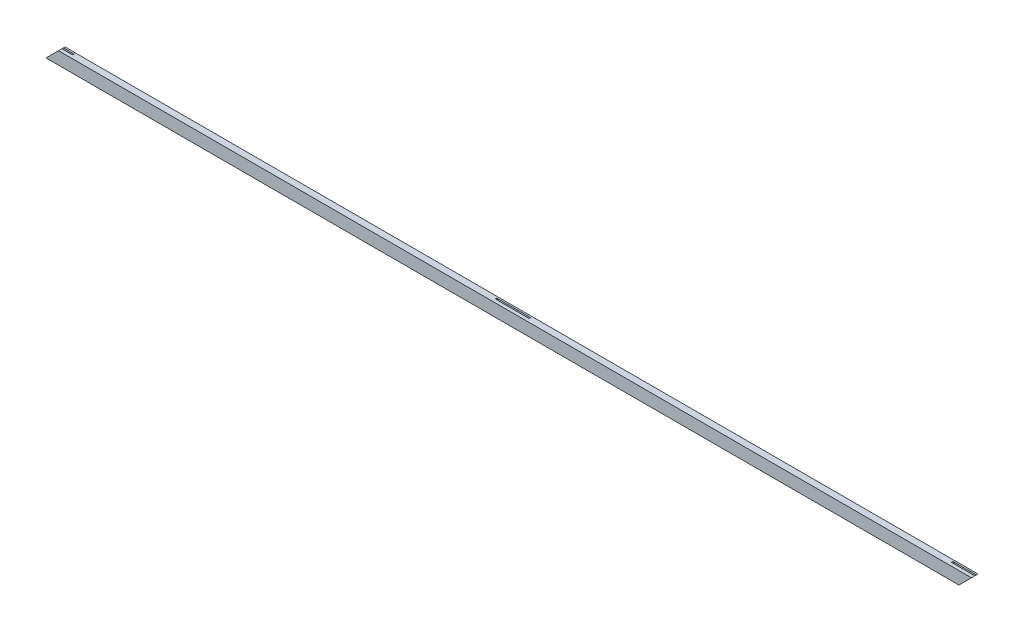
ISO-10303-21;
HEADER;
FILE_DESCRIPTION(('STEP AP214'),'2;1');
FILE_NAME('part.step','',(''),(''),'','','');
FILE_SCHEMA(('AUTOMOTIVE_DESIGN { 1 0 10303 214 1 1 1 1 }'));
ENDSEC;
DATA;
#1=APPLICATION_CONTEXT('core data for automotive mechanical design processes');
#2=APPLICATION_PROTOCOL_DEFINITION('international standard','automotive_design',2000,#1);
#3=PRODUCT_CONTEXT('',#1,'mechanical');
#4=PRODUCT('Part','Part','',(#3));
#5=PRODUCT_RELATED_PRODUCT_CATEGORY('part','',(#4));
#6=PRODUCT_DEFINITION_FORMATION('','',#4);
#7=PRODUCT_DEFINITION_CONTEXT('part definition',#1,'design');
#8=PRODUCT_DEFINITION('design','',#6,#7);
#9=PRODUCT_DEFINITION_SHAPE('','',#8);
#10=(LENGTH_UNIT() NAMED_UNIT(*) SI_UNIT(.MILLI.,.METRE.));
#11=(NAMED_UNIT(*) PLANE_ANGLE_UNIT() SI_UNIT($,.RADIAN.));
#12=(NAMED_UNIT(*) SI_UNIT($,.STERADIAN.) SOLID_ANGLE_UNIT());
#13=UNCERTAINTY_MEASURE_WITH_UNIT(LENGTH_MEASURE(1.E-05),#10,'distance_accuracy_value','');
#14=(GEOMETRIC_REPRESENTATION_CONTEXT(3) GLOBAL_UNCERTAINTY_ASSIGNED_CONTEXT((#13)) GLOBAL_UNIT_ASSIGNED_CONTEXT((#10,
#11,#12)) REPRESENTATION_CONTEXT('',''));
#15=CARTESIAN_POINT('',(0.,0.,0.));
#16=DIRECTION('',(0.,0.,1.));
#17=DIRECTION('',(1.,0.,0.));
#18=AXIS2_PLACEMENT_3D('',#15,#16,#17);
#19=CARTESIAN_POINT('',(3546.,48.0000000000002,25.));
#20=DIRECTION('',(0.,-1.,0.));
#21=DIRECTION('',(1.,0.,0.));
#22=AXIS2_PLACEMENT_3D('',#19,#20,#21);
#23=PLANE('',#22);
#24=DIRECTION('',(0.,0.,-1.));
#25=VECTOR('',#24,1.);
#26=CARTESIAN_POINT('',(1838.,48.,6.00000000000001));
#27=LINE('',#26,#25);
#28=CARTESIAN_POINT('',(1838.,48.,6.00000000000001));
#29=VERTEX_POINT('',#28);
#30=CARTESIAN_POINT('',(1838.,48.,12.));
#31=VERTEX_POINT('',#30);
#32=EDGE_CURVE('E395',#29,#31,#27,.F.);
#33=ORIENTED_EDGE('',*,*,#32,.T.);
#34=DIRECTION('',(-1.,0.,0.));
#35=VECTOR('',#34,1.);
#36=CARTESIAN_POINT('',(1830.5,48.,12.));
#37=LINE('',#36,#35);
#38=CARTESIAN_POINT('',(1708.,48.,12.));
#39=VERTEX_POINT('',#38);
#40=EDGE_CURVE('E11',#31,#39,#37,.T.);
#41=ORIENTED_EDGE('',*,*,#40,.T.);
#42=DIRECTION('',(0.,0.,1.));
#43=VECTOR('',#42,1.);
#44=CARTESIAN_POINT('',(1708.,48.,12.));
#45=LINE('',#44,#43);
#46=CARTESIAN_POINT('',(1708.,48.,6.));
#47=VERTEX_POINT('',#46);
#48=EDGE_CURVE('E431',#39,#47,#45,.F.);
#49=ORIENTED_EDGE('',*,*,#48,.T.);
#50=DIRECTION('',(1.,0.,0.));
#51=VECTOR('',#50,1.);
#52=CARTESIAN_POINT('',(1715.5,48.,6.));
#53=LINE('',#52,#51);
#54=EDGE_CURVE('E426',#47,#29,#53,.T.);
#55=ORIENTED_EDGE('',*,*,#54,.T.);
#56=EDGE_LOOP('',(#33,#41,#49,#55));
#57=FACE_BOUND('',#56,.T.);
#58=DIRECTION('',(-1.,0.,0.));
#59=VECTOR('',#58,1.);
#60=CARTESIAN_POINT('',(89.5000000000006,48.0000000000002,6.));
#61=LINE('',#60,#59);
#62=CARTESIAN_POINT('',(89.5000000000006,48.0000000000002,6.));
#63=VERTEX_POINT('',#62);
#64=CARTESIAN_POINT('',(48.0000000000001,47.9999999999996,6.));
#65=VERTEX_POINT('',#64);
#66=EDGE_CURVE('E287',#63,#65,#61,.T.);
#67=ORIENTED_EDGE('',*,*,#66,.F.);
#68=DIRECTION('',(0.,0.,1.));
#69=VECTOR('',#68,1.);
#70=CARTESIAN_POINT('',(89.5000000000006,48.0000000000002,6.));
#71=LINE('',#70,#69);
#72=CARTESIAN_POINT('',(89.5000000000006,48.0000000000002,12.));
#73=VERTEX_POINT('',#72);
#74=EDGE_CURVE('E294',#63,#73,#71,.T.);
#75=ORIENTED_EDGE('',*,*,#74,.T.);
#76=DIRECTION('',(-1.,0.,0.));
#77=VECTOR('',#76,1.);
#78=CARTESIAN_POINT('',(89.5000000000006,48.0000000000002,12.));
#79=LINE('',#78,#77);
#80=CARTESIAN_POINT('',(48.0000000000001,47.9999999999996,12.));
#81=VERTEX_POINT('',#80);
#82=EDGE_CURVE('E298',#73,#81,#79,.T.);
#83=ORIENTED_EDGE('',*,*,#82,.T.);
#84=DIRECTION('',(0.,0.,-1.));
#85=VECTOR('',#84,1.);
#86=CARTESIAN_POINT('',(48.0000000000001,47.9999999999996,25.));
#87=LINE('',#86,#85);
#88=CARTESIAN_POINT('',(48.0000000000001,47.9999999999996,25.));
#89=VERTEX_POINT('',#88);
#90=EDGE_CURVE('E392',#89,#81,#87,.T.);
#91=ORIENTED_EDGE('',*,*,#90,.F.);
#92=DIRECTION('',(-1.,0.,0.));
#93=VECTOR('',#92,1.);
#94=CARTESIAN_POINT('',(3546.,48.0000000000002,25.));
#95=LINE('',#94,#93);
#96=CARTESIAN_POINT('',(3546.,48.0000000000002,25.));
#97=VERTEX_POINT('',#96);
#98=EDGE_CURVE('E358',#97,#89,#95,.T.);
#99=ORIENTED_EDGE('',*,*,#98,.F.);
#100=DIRECTION('',(0.,0.,-1.));
#101=VECTOR('',#100,1.);
#102=CARTESIAN_POINT('',(3546.,48.0000000000002,25.));
#103=LINE('',#102,#101);
#104=CARTESIAN_POINT('',(3546.,48.0000000000002,12.));
#105=VERTEX_POINT('',#104);
#106=EDGE_CURVE('E381',#97,#105,#103,.T.);
#107=ORIENTED_EDGE('',*,*,#106,.T.);
#108=DIRECTION('',(-1.,0.,0.));
#109=VECTOR('',#108,1.);
#110=CARTESIAN_POINT('',(3546.,48.0000000000002,12.));
#111=LINE('',#110,#109);
#112=CARTESIAN_POINT('',(3456.5,48.0000000000002,12.));
#113=VERTEX_POINT('',#112);
#114=EDGE_CURVE('E279',#105,#113,#111,.T.);
#115=ORIENTED_EDGE('',*,*,#114,.T.);
#116=DIRECTION('',(0.,0.,1.));
#117=VECTOR('',#116,1.);
#118=CARTESIAN_POINT('',(3456.5,48.0000000000002,6.));
#119=LINE('',#118,#117);
#120=CARTESIAN_POINT('',(3456.5,48.0000000000002,6.));
#121=VERTEX_POINT('',#120);
#122=EDGE_CURVE('E322',#121,#113,#119,.T.);
#123=ORIENTED_EDGE('',*,*,#122,.F.);
#124=DIRECTION('',(-1.,0.,0.));
#125=VECTOR('',#124,1.);
#126=CARTESIAN_POINT('',(3546.,48.0000000000002,6.));
#127=LINE('',#126,#125);
#128=CARTESIAN_POINT('',(3546.,48.0000000000002,6.));
#129=VERTEX_POINT('',#128);
#130=EDGE_CURVE('E310',#129,#121,#127,.T.);
#131=ORIENTED_EDGE('',*,*,#130,.F.);
#132=CARTESIAN_POINT('',(3546.,48.0000000000002,0.));
#133=VERTEX_POINT('',#132);
#134=EDGE_CURVE('E368',#129,#133,#103,.T.);
#135=ORIENTED_EDGE('',*,*,#134,.T.);
#136=DIRECTION('',(-1.,0.,0.));
#137=VECTOR('',#136,1.);
#138=CARTESIAN_POINT('',(3546.,48.0000000000002,0.));
#139=LINE('',#138,#137);
#140=CARTESIAN_POINT('',(48.0000000000001,47.9999999999996,0.));
#141=VERTEX_POINT('',#140);
#142=EDGE_CURVE('E369',#133,#141,#139,.T.);
#143=ORIENTED_EDGE('',*,*,#142,.T.);
#144=EDGE_CURVE('E391',#65,#141,#87,.T.);
#145=ORIENTED_EDGE('',*,*,#144,.F.);
#146=EDGE_LOOP('',(#67,#75,#83,#91,#99,#107,#115,#123,#131,#135,#143,#145));
#147=FACE_BOUND('',#146,.T.);
#148=ADVANCED_FACE('F35',(#57,#147),#23,.F.);
#149=CARTESIAN_POINT('',(48.0000000000001,47.9999999999996,25.));
#150=DIRECTION('',(0.707106781186544,-0.707106781186551,0.));
#151=DIRECTION('',(0.707106781186551,0.707106781186544,0.));
#152=AXIS2_PLACEMENT_3D('',#149,#150,#151);
#153=PLANE('',#152);
#154=DIRECTION('',(-0.707106781186547,-0.707106781186547,0.));
#155=VECTOR('',#154,1.);
#156=CARTESIAN_POINT('',(48.0000000000001,47.9999999999996,6.));
#157=LINE('',#156,#155);
#158=CARTESIAN_POINT('',(40.5000000000007,40.5000000000002,6.));
#159=VERTEX_POINT('',#158);
#160=EDGE_CURVE('E289',#65,#159,#157,.T.);
#161=ORIENTED_EDGE('',*,*,#160,.F.);
#162=ORIENTED_EDGE('',*,*,#144,.T.);
#163=DIRECTION('',(-0.707106781186551,-0.707106781186544,0.));
#164=VECTOR('',#163,1.);
#165=CARTESIAN_POINT('',(48.0000000000001,47.9999999999996,0.));
#166=LINE('',#165,#164);
#167=CARTESIAN_POINT('',(0.,0.,0.));
#168=VERTEX_POINT('',#167);
#169=EDGE_CURVE('E372',#141,#168,#166,.T.);
#170=ORIENTED_EDGE('',*,*,#169,.T.);
#171=DIRECTION('',(0.,0.,-1.));
#172=VECTOR('',#171,1.);
#173=CARTESIAN_POINT('',(0.,0.,25.));
#174=LINE('',#173,#172);
#175=CARTESIAN_POINT('',(0.,0.,6.));
#176=VERTEX_POINT('',#175);
#177=EDGE_CURVE('E388',#176,#168,#174,.T.);
#178=ORIENTED_EDGE('',*,*,#177,.F.);
#179=DIRECTION('',(-0.707106781186571,-0.707106781186525,0.));
#180=VECTOR('',#179,1.);
#181=CARTESIAN_POINT('',(0.,0.,6.));
#182=LINE('',#181,#180);
#183=CARTESIAN_POINT('',(7.50000000000048,7.49999999999999,6.));
#184=VERTEX_POINT('',#183);
#185=EDGE_CURVE('E236',#184,#176,#182,.T.);
#186=ORIENTED_EDGE('',*,*,#185,.F.);
#187=DIRECTION('',(0.,0.,1.));
#188=VECTOR('',#187,1.);
#189=CARTESIAN_POINT('',(7.50000000000048,7.49999999999999,6.));
#190=LINE('',#189,#188);
#191=CARTESIAN_POINT('',(7.50000000000048,7.49999999999999,12.));
#192=VERTEX_POINT('',#191);
#193=EDGE_CURVE('E246',#184,#192,#190,.T.);
#194=ORIENTED_EDGE('',*,*,#193,.T.);
#195=DIRECTION('',(-0.707106781186571,-0.707106781186525,0.));
#196=VECTOR('',#195,1.);
#197=CARTESIAN_POINT('',(0.,0.,12.));
#198=LINE('',#197,#196);
#199=CARTESIAN_POINT('',(0.,0.,12.));
#200=VERTEX_POINT('',#199);
#201=EDGE_CURVE('E239',#192,#200,#198,.T.);
#202=ORIENTED_EDGE('',*,*,#201,.T.);
#203=CARTESIAN_POINT('',(0.,0.,25.));
#204=VERTEX_POINT('',#203);
#205=EDGE_CURVE('E389',#204,#200,#174,.T.);
#206=ORIENTED_EDGE('',*,*,#205,.F.);
#207=DIRECTION('',(-0.707106781186551,-0.707106781186544,0.));
#208=VECTOR('',#207,1.);
#209=CARTESIAN_POINT('',(48.0000000000001,47.9999999999996,25.));
#210=LINE('',#209,#208);
#211=EDGE_CURVE('E361',#89,#204,#210,.T.);
#212=ORIENTED_EDGE('',*,*,#211,.F.);
#213=ORIENTED_EDGE('',*,*,#90,.T.);
#214=DIRECTION('',(-0.707106781186547,-0.707106781186547,0.));
#215=VECTOR('',#214,1.);
#216=CARTESIAN_POINT('',(48.0000000000001,47.9999999999996,12.));
#217=LINE('',#216,#215);
#218=CARTESIAN_POINT('',(40.5000000000007,40.5000000000003,12.));
#219=VERTEX_POINT('',#218);
#220=EDGE_CURVE('E301',#81,#219,#217,.T.);
#221=ORIENTED_EDGE('',*,*,#220,.T.);
#222=DIRECTION('',(0.,0.,1.));
#223=VECTOR('',#222,1.);
#224=CARTESIAN_POINT('',(40.5000000000007,40.5000000000002,6.));
#225=LINE('',#224,#223);
#226=EDGE_CURVE('E306',#159,#219,#225,.T.);
#227=ORIENTED_EDGE('',*,*,#226,.F.);
#228=EDGE_LOOP('',(#161,#162,#170,#178,#186,#194,#202,#206,#212,#213,#221,#227));
#229=FACE_BOUND('',#228,.T.);
#230=ADVANCED_FACE('F460',(#229),#153,.F.);
#231=CARTESIAN_POINT('',(3498.,0.,25.));
#232=DIRECTION('',(-0.707106781186549,0.707106781186546,0.));
#233=DIRECTION('',(-0.707106781186546,-0.707106781186549,0.));
#234=AXIS2_PLACEMENT_3D('',#231,#232,#233);
#235=PLANE('',#234);
#236=DIRECTION('',(0.,0.,1.));
#237=VECTOR('',#236,1.);
#238=CARTESIAN_POINT('',(3505.5,7.5,6.));
#239=LINE('',#238,#237);
#240=CARTESIAN_POINT('',(3505.5,7.5,6.));
#241=VERTEX_POINT('',#240);
#242=CARTESIAN_POINT('',(3505.5,7.5,12.));
#243=VERTEX_POINT('',#242);
#244=EDGE_CURVE('E263',#241,#243,#239,.T.);
#245=ORIENTED_EDGE('',*,*,#244,.F.);
#246=DIRECTION('',(0.70710678118654,0.707106781186555,0.));
#247=VECTOR('',#246,1.);
#248=CARTESIAN_POINT('',(3505.5,7.5,6.));
#249=LINE('',#248,#247);
#250=CARTESIAN_POINT('',(3498.,0.,6.));
#251=VERTEX_POINT('',#250);
#252=EDGE_CURVE('E253',#251,#241,#249,.T.);
#253=ORIENTED_EDGE('',*,*,#252,.F.);
#254=DIRECTION('',(0.,0.,-1.));
#255=VECTOR('',#254,1.);
#256=CARTESIAN_POINT('',(3498.,0.,25.));
#257=LINE('',#256,#255);
#258=CARTESIAN_POINT('',(3498.,0.,0.));
#259=VERTEX_POINT('',#258);
#260=EDGE_CURVE('E384',#251,#259,#257,.T.);
#261=ORIENTED_EDGE('',*,*,#260,.T.);
#262=DIRECTION('',(0.707106781186546,0.707106781186549,0.));
#263=VECTOR('',#262,1.);
#264=CARTESIAN_POINT('',(3498.,0.,0.));
#265=LINE('',#264,#263);
#266=EDGE_CURVE('E362',#259,#133,#265,.T.);
#267=ORIENTED_EDGE('',*,*,#266,.T.);
#268=ORIENTED_EDGE('',*,*,#134,.F.);
#269=DIRECTION('',(0.70710678118654,0.707106781186555,0.));
#270=VECTOR('',#269,1.);
#271=CARTESIAN_POINT('',(3538.5,40.5000000000002,6.));
#272=LINE('',#271,#270);
#273=CARTESIAN_POINT('',(3538.5,40.5000000000002,6.));
#274=VERTEX_POINT('',#273);
#275=EDGE_CURVE('E320',#274,#129,#272,.T.);
#276=ORIENTED_EDGE('',*,*,#275,.F.);
#277=DIRECTION('',(0.,0.,1.));
#278=VECTOR('',#277,1.);
#279=CARTESIAN_POINT('',(3538.5,40.5000000000002,6.));
#280=LINE('',#279,#278);
#281=CARTESIAN_POINT('',(3538.5,40.5000000000002,12.));
#282=VERTEX_POINT('',#281);
#283=EDGE_CURVE('E332',#274,#282,#280,.T.);
#284=ORIENTED_EDGE('',*,*,#283,.T.);
#285=DIRECTION('',(0.70710678118654,0.707106781186555,0.));
#286=VECTOR('',#285,1.);
#287=CARTESIAN_POINT('',(3538.5,40.5000000000002,12.));
#288=LINE('',#287,#286);
#289=EDGE_CURVE('E314',#282,#105,#288,.T.);
#290=ORIENTED_EDGE('',*,*,#289,.T.);
#291=ORIENTED_EDGE('',*,*,#106,.F.);
#292=DIRECTION('',(0.707106781186546,0.707106781186549,0.));
#293=VECTOR('',#292,1.);
#294=CARTESIAN_POINT('',(3498.,0.,25.));
#295=LINE('',#294,#293);
#296=CARTESIAN_POINT('',(3498.,0.,25.));
#297=VERTEX_POINT('',#296);
#298=EDGE_CURVE('E366',#297,#97,#295,.T.);
#299=ORIENTED_EDGE('',*,*,#298,.F.);
#300=CARTESIAN_POINT('',(3498.,0.,12.));
#301=VERTEX_POINT('',#300);
#302=EDGE_CURVE('E385',#297,#301,#257,.T.);
#303=ORIENTED_EDGE('',*,*,#302,.T.);
#304=DIRECTION('',(0.70710678118654,0.707106781186555,0.));
#305=VECTOR('',#304,1.);
#306=CARTESIAN_POINT('',(3505.5,7.5,12.));
#307=LINE('',#306,#305);
#308=EDGE_CURVE('E267',#301,#243,#307,.T.);
#309=ORIENTED_EDGE('',*,*,#308,.T.);
#310=EDGE_LOOP('',(#245,#253,#261,#267,#268,#276,#284,#290,#291,#299,#303,#309));
#311=FACE_BOUND('',#310,.T.);
#312=ADVANCED_FACE('F465',(#311),#235,.F.);
#313=CARTESIAN_POINT('',(1830.5,40.5,12.));
#314=DIRECTION('',(0.,0.,1.));
#315=DIRECTION('',(1.,0.,0.));
#316=AXIS2_PLACEMENT_3D('',#313,#314,#315);
#317=PLANE('',#316);
#318=ORIENTED_EDGE('',*,*,#40,.F.);
#319=DIRECTION('',(-0.707106781186549,-0.707106781186546,0.));
#320=VECTOR('',#319,1.);
#321=CARTESIAN_POINT('',(1830.5,40.5,12.));
#322=LINE('',#321,#320);
#323=CARTESIAN_POINT('',(1830.5,40.5,12.));
#324=VERTEX_POINT('',#323);
#325=EDGE_CURVE('E409',#324,#31,#322,.F.);
#326=ORIENTED_EDGE('',*,*,#325,.F.);
#327=DIRECTION('',(-1.,0.,0.));
#328=VECTOR('',#327,1.);
#329=CARTESIAN_POINT('',(1830.5,40.5,12.));
#330=LINE('',#329,#328);
#331=CARTESIAN_POINT('',(1715.5,40.5,12.));
#332=VERTEX_POINT('',#331);
#333=EDGE_CURVE('E420',#324,#332,#330,.T.);
#334=ORIENTED_EDGE('',*,*,#333,.T.);
#335=DIRECTION('',(0.707106781186549,-0.707106781186546,0.));
#336=VECTOR('',#335,1.);
#337=CARTESIAN_POINT('',(1773.,-17.0000000000001,12.));
#338=LINE('',#337,#336);
#339=EDGE_CURVE('E43',#332,#39,#338,.F.);
#340=ORIENTED_EDGE('',*,*,#339,.T.);
#341=EDGE_LOOP('',(#318,#326,#334,#340));
#342=FACE_BOUND('',#341,.T.);
#343=ADVANCED_FACE('F37',(#342),#317,.F.);
#344=CARTESIAN_POINT('',(1715.5,40.5,12.));
#345=DIRECTION('',(0.707106781186546,0.707106781186549,0.));
#346=DIRECTION('',(0.707106781186549,-0.707106781186546,0.));
#347=AXIS2_PLACEMENT_3D('',#344,#345,#346);
#348=PLANE('',#347);
#349=ORIENTED_EDGE('',*,*,#48,.F.);
#350=ORIENTED_EDGE('',*,*,#339,.F.);
#351=DIRECTION('',(0.,0.,-1.));
#352=VECTOR('',#351,1.);
#353=CARTESIAN_POINT('',(1715.5,40.5,12.));
#354=LINE('',#353,#352);
#355=CARTESIAN_POINT('',(1715.5,40.5,6.));
#356=VERTEX_POINT('',#355);
#357=EDGE_CURVE('E423',#332,#356,#354,.T.);
#358=ORIENTED_EDGE('',*,*,#357,.T.);
#359=DIRECTION('',(0.707106781186549,-0.707106781186546,0.));
#360=VECTOR('',#359,1.);
#361=CARTESIAN_POINT('',(1715.5,40.5,6.));
#362=LINE('',#361,#360);
#363=EDGE_CURVE('E428',#356,#47,#362,.F.);
#364=ORIENTED_EDGE('',*,*,#363,.T.);
#365=EDGE_LOOP('',(#349,#350,#358,#364));
#366=FACE_BOUND('',#365,.T.);
#367=ADVANCED_FACE('F438',(#366),#348,.T.);
#368=CARTESIAN_POINT('',(1715.5,40.5,6.));
#369=DIRECTION('',(0.,0.,-1.));
#370=DIRECTION('',(-1.,0.,0.));
#371=AXIS2_PLACEMENT_3D('',#368,#369,#370);
#372=PLANE('',#371);
#373=ORIENTED_EDGE('',*,*,#54,.F.);
#374=ORIENTED_EDGE('',*,*,#363,.F.);
#375=DIRECTION('',(1.,0.,0.));
#376=VECTOR('',#375,1.);
#377=CARTESIAN_POINT('',(1715.5,40.5,6.));
#378=LINE('',#377,#376);
#379=CARTESIAN_POINT('',(1830.5,40.5,6.00000000000001));
#380=VERTEX_POINT('',#379);
#381=EDGE_CURVE('E418',#356,#380,#378,.T.);
#382=ORIENTED_EDGE('',*,*,#381,.T.);
#383=DIRECTION('',(-0.707106781186549,-0.707106781186546,0.));
#384=VECTOR('',#383,1.);
#385=CARTESIAN_POINT('',(1773.,-17.0000000000001,6.));
#386=LINE('',#385,#384);
#387=EDGE_CURVE('E415',#380,#29,#386,.F.);
#388=ORIENTED_EDGE('',*,*,#387,.T.);
#389=EDGE_LOOP('',(#373,#374,#382,#388));
#390=FACE_BOUND('',#389,.T.);
#391=ADVANCED_FACE('F451',(#390),#372,.F.);
#392=CARTESIAN_POINT('',(0.,40.5,0.));
#393=DIRECTION('',(0.,1.,0.));
#394=DIRECTION('',(0.,0.,-1.));
#395=AXIS2_PLACEMENT_3D('',#392,#393,#394);
#396=PLANE('',#395);
#397=ORIENTED_EDGE('',*,*,#381,.F.);
#398=ORIENTED_EDGE('',*,*,#357,.F.);
#399=ORIENTED_EDGE('',*,*,#333,.F.);
#400=DIRECTION('',(0.,0.,1.));
#401=VECTOR('',#400,1.);
#402=CARTESIAN_POINT('',(1830.5,40.5,6.00000000000001));
#403=LINE('',#402,#401);
#404=EDGE_CURVE('E412',#380,#324,#403,.T.);
#405=ORIENTED_EDGE('',*,*,#404,.F.);
#406=EDGE_LOOP('',(#397,#398,#399,#405));
#407=FACE_BOUND('',#406,.T.);
#408=ADVANCED_FACE('F449',(#407),#396,.T.);
#409=CARTESIAN_POINT('',(1830.5,40.5,6.00000000000001));
#410=DIRECTION('',(-0.707106781186546,0.707106781186549,0.));
#411=DIRECTION('',(0.707106781186549,0.707106781186546,0.));
#412=AXIS2_PLACEMENT_3D('',#409,#410,#411);
#413=PLANE('',#412);
#414=ORIENTED_EDGE('',*,*,#32,.F.);
#415=ORIENTED_EDGE('',*,*,#387,.F.);
#416=ORIENTED_EDGE('',*,*,#404,.T.);
#417=ORIENTED_EDGE('',*,*,#325,.T.);
#418=EDGE_LOOP('',(#414,#415,#416,#417));
#419=FACE_BOUND('',#418,.T.);
#420=ADVANCED_FACE('F445',(#419),#413,.T.);
#421=CARTESIAN_POINT('',(0.,0.,25.));
#422=DIRECTION('',(0.,1.,0.));
#423=DIRECTION('',(0.,0.,1.));
#424=AXIS2_PLACEMENT_3D('',#421,#422,#423);
#425=PLANE('',#424);
#426=DIRECTION('',(0.,0.,-1.));
#427=VECTOR('',#426,1.);
#428=CARTESIAN_POINT('',(1838.,0.,6.00000000000001));
#429=LINE('',#428,#427);
#430=CARTESIAN_POINT('',(1838.,0.,6.00000000000001));
#431=VERTEX_POINT('',#430);
#432=CARTESIAN_POINT('',(1838.,0.,12.));
#433=VERTEX_POINT('',#432);
#434=EDGE_CURVE('E354',#431,#433,#429,.F.);
#435=ORIENTED_EDGE('',*,*,#434,.F.);
#436=DIRECTION('',(1.,0.,0.));
#437=VECTOR('',#436,1.);
#438=CARTESIAN_POINT('',(1715.5,0.,6.));
#439=LINE('',#438,#437);
#440=CARTESIAN_POINT('',(1708.,0.,6.));
#441=VERTEX_POINT('',#440);
#442=EDGE_CURVE('E335',#441,#431,#439,.T.);
#443=ORIENTED_EDGE('',*,*,#442,.F.);
#444=DIRECTION('',(0.,0.,1.));
#445=VECTOR('',#444,1.);
#446=CARTESIAN_POINT('',(1708.,0.,12.));
#447=LINE('',#446,#445);
#448=CARTESIAN_POINT('',(1708.,0.,12.));
#449=VERTEX_POINT('',#448);
#450=EDGE_CURVE('E343',#449,#441,#447,.F.);
#451=ORIENTED_EDGE('',*,*,#450,.F.);
#452=DIRECTION('',(-1.,0.,0.));
#453=VECTOR('',#452,1.);
#454=CARTESIAN_POINT('',(1830.5,0.,12.));
#455=LINE('',#454,#453);
#456=EDGE_CURVE('E355',#433,#449,#455,.T.);
#457=ORIENTED_EDGE('',*,*,#456,.F.);
#458=EDGE_LOOP('',(#435,#443,#451,#457));
#459=FACE_BOUND('',#458,.T.);
#460=ORIENTED_EDGE('',*,*,#260,.F.);
#461=DIRECTION('',(1.,0.,0.));
#462=VECTOR('',#461,1.);
#463=CARTESIAN_POINT('',(3498.,0.,6.));
#464=LINE('',#463,#462);
#465=CARTESIAN_POINT('',(3456.5,0.,6.));
#466=VERTEX_POINT('',#465);
#467=EDGE_CURVE('E251',#466,#251,#464,.T.);
#468=ORIENTED_EDGE('',*,*,#467,.F.);
#469=DIRECTION('',(0.,0.,1.));
#470=VECTOR('',#469,1.);
#471=CARTESIAN_POINT('',(3456.5,0.,6.));
#472=LINE('',#471,#470);
#473=CARTESIAN_POINT('',(3456.5,0.,12.));
#474=VERTEX_POINT('',#473);
#475=EDGE_CURVE('E276',#466,#474,#472,.T.);
#476=ORIENTED_EDGE('',*,*,#475,.T.);
#477=DIRECTION('',(1.,0.,0.));
#478=VECTOR('',#477,1.);
#479=CARTESIAN_POINT('',(3498.,0.,12.));
#480=LINE('',#479,#478);
#481=EDGE_CURVE('E264',#474,#301,#480,.T.);
#482=ORIENTED_EDGE('',*,*,#481,.T.);
#483=ORIENTED_EDGE('',*,*,#302,.F.);
#484=DIRECTION('',(1.,0.,0.));
#485=VECTOR('',#484,1.);
#486=CARTESIAN_POINT('',(0.,0.,25.));
#487=LINE('',#486,#485);
#488=EDGE_CURVE('E364',#204,#297,#487,.T.);
#489=ORIENTED_EDGE('',*,*,#488,.F.);
#490=ORIENTED_EDGE('',*,*,#205,.T.);
#491=DIRECTION('',(1.,0.,0.));
#492=VECTOR('',#491,1.);
#493=CARTESIAN_POINT('',(89.5,0.,12.));
#494=LINE('',#493,#492);
#495=CARTESIAN_POINT('',(89.5,0.,12.));
#496=VERTEX_POINT('',#495);
#497=EDGE_CURVE('E244',#200,#496,#494,.T.);
#498=ORIENTED_EDGE('',*,*,#497,.T.);
#499=DIRECTION('',(0.,0.,1.));
#500=VECTOR('',#499,1.);
#501=CARTESIAN_POINT('',(89.5,0.,6.));
#502=LINE('',#501,#500);
#503=CARTESIAN_POINT('',(89.5,0.,6.));
#504=VERTEX_POINT('',#503);
#505=EDGE_CURVE('E224',#504,#496,#502,.T.);
#506=ORIENTED_EDGE('',*,*,#505,.F.);
#507=DIRECTION('',(1.,0.,0.));
#508=VECTOR('',#507,1.);
#509=CARTESIAN_POINT('',(89.5,0.,6.));
#510=LINE('',#509,#508);
#511=EDGE_CURVE('E231',#176,#504,#510,.T.);
#512=ORIENTED_EDGE('',*,*,#511,.F.);
#513=ORIENTED_EDGE('',*,*,#177,.T.);
#514=DIRECTION('',(1.,0.,0.));
#515=VECTOR('',#514,1.);
#516=CARTESIAN_POINT('',(0.,0.,0.));
#517=LINE('',#516,#515);
#518=EDGE_CURVE('E376',#168,#259,#517,.T.);
#519=ORIENTED_EDGE('',*,*,#518,.T.);
#520=EDGE_LOOP('',(#460,#468,#476,#482,#483,#489,#490,#498,#506,#512,#513,#519));
#521=FACE_BOUND('',#520,.T.);
#522=ADVANCED_FACE('F242',(#459,#521),#425,.F.);
#523=CARTESIAN_POINT('',(0.,0.,25.));
#524=DIRECTION('',(0.,0.,1.));
#525=DIRECTION('',(1.,0.,0.));
#526=AXIS2_PLACEMENT_3D('',#523,#524,#525);
#527=PLANE('',#526);
#528=ORIENTED_EDGE('',*,*,#98,.T.);
#529=ORIENTED_EDGE('',*,*,#211,.T.);
#530=ORIENTED_EDGE('',*,*,#488,.T.);
#531=ORIENTED_EDGE('',*,*,#298,.T.);
#532=EDGE_LOOP('',(#528,#529,#530,#531));
#533=FACE_BOUND('',#532,.T.);
#534=ADVANCED_FACE('F485',(#533),#527,.T.);
#535=CARTESIAN_POINT('',(0.,0.,0.));
#536=DIRECTION('',(0.,0.,1.));
#537=DIRECTION('',(1.,0.,0.));
#538=AXIS2_PLACEMENT_3D('',#535,#536,#537);
#539=PLANE('',#538);
#540=ORIENTED_EDGE('',*,*,#142,.F.);
#541=ORIENTED_EDGE('',*,*,#266,.F.);
#542=ORIENTED_EDGE('',*,*,#518,.F.);
#543=ORIENTED_EDGE('',*,*,#169,.F.);
#544=EDGE_LOOP('',(#540,#541,#542,#543));
#545=FACE_BOUND('',#544,.T.);
#546=ADVANCED_FACE('F490',(#545),#539,.F.);
#547=CARTESIAN_POINT('',(1715.5,7.5,6.));
#548=DIRECTION('',(0.,0.,-1.));
#549=DIRECTION('',(-1.,0.,0.));
#550=AXIS2_PLACEMENT_3D('',#547,#548,#549);
#551=PLANE('',#550);
#552=ORIENTED_EDGE('',*,*,#442,.T.);
#553=DIRECTION('',(-0.707106781186549,0.707106781186546,0.));
#554=VECTOR('',#553,1.);
#555=CARTESIAN_POINT('',(1773.,65.0000000000001,6.));
#556=LINE('',#555,#554);
#557=CARTESIAN_POINT('',(1830.5,7.5,6.00000000000001));
#558=VERTEX_POINT('',#557);
#559=EDGE_CURVE('E352',#558,#431,#556,.F.);
#560=ORIENTED_EDGE('',*,*,#559,.F.);
#561=DIRECTION('',(1.,0.,0.));
#562=VECTOR('',#561,1.);
#563=CARTESIAN_POINT('',(1715.5,7.5,6.));
#564=LINE('',#563,#562);
#565=CARTESIAN_POINT('',(1715.5,7.5,6.));
#566=VERTEX_POINT('',#565);
#567=EDGE_CURVE('E339',#566,#558,#564,.T.);
#568=ORIENTED_EDGE('',*,*,#567,.F.);
#569=DIRECTION('',(0.707106781186549,0.707106781186546,0.));
#570=VECTOR('',#569,1.);
#571=CARTESIAN_POINT('',(1715.5,7.5,6.));
#572=LINE('',#571,#570);
#573=EDGE_CURVE('E373',#566,#441,#572,.F.);
#574=ORIENTED_EDGE('',*,*,#573,.T.);
#575=EDGE_LOOP('',(#552,#560,#568,#574));
#576=FACE_BOUND('',#575,.T.);
#577=ADVANCED_FACE('F479',(#576),#551,.F.);
#578=CARTESIAN_POINT('',(1715.5,7.5,12.));
#579=DIRECTION('',(0.707106781186546,-0.707106781186549,0.));
#580=DIRECTION('',(0.707106781186549,0.707106781186546,0.));
#581=AXIS2_PLACEMENT_3D('',#578,#579,#580);
#582=PLANE('',#581);
#583=ORIENTED_EDGE('',*,*,#450,.T.);
#584=ORIENTED_EDGE('',*,*,#573,.F.);
#585=DIRECTION('',(0.,0.,-1.));
#586=VECTOR('',#585,1.);
#587=CARTESIAN_POINT('',(1715.5,7.5,12.));
#588=LINE('',#587,#586);
#589=CARTESIAN_POINT('',(1715.5,7.5,12.));
#590=VERTEX_POINT('',#589);
#591=EDGE_CURVE('E349',#590,#566,#588,.T.);
#592=ORIENTED_EDGE('',*,*,#591,.F.);
#593=DIRECTION('',(0.707106781186549,0.707106781186546,0.));
#594=VECTOR('',#593,1.);
#595=CARTESIAN_POINT('',(1773.,65.0000000000001,12.));
#596=LINE('',#595,#594);
#597=EDGE_CURVE('E402',#590,#449,#596,.F.);
#598=ORIENTED_EDGE('',*,*,#597,.T.);
#599=EDGE_LOOP('',(#583,#584,#592,#598));
#600=FACE_BOUND('',#599,.T.);
#601=ADVANCED_FACE('F476',(#600),#582,.T.);
#602=CARTESIAN_POINT('',(1830.5,7.5,12.));
#603=DIRECTION('',(0.,0.,1.));
#604=DIRECTION('',(1.,0.,0.));
#605=AXIS2_PLACEMENT_3D('',#602,#603,#604);
#606=PLANE('',#605);
#607=ORIENTED_EDGE('',*,*,#456,.T.);
#608=ORIENTED_EDGE('',*,*,#597,.F.);
#609=DIRECTION('',(-1.,0.,0.));
#610=VECTOR('',#609,1.);
#611=CARTESIAN_POINT('',(1830.5,7.5,12.));
#612=LINE('',#611,#610);
#613=CARTESIAN_POINT('',(1830.5,7.5,12.));
#614=VERTEX_POINT('',#613);
#615=EDGE_CURVE('E346',#614,#590,#612,.T.);
#616=ORIENTED_EDGE('',*,*,#615,.F.);
#617=DIRECTION('',(-0.707106781186549,0.707106781186546,0.));
#618=VECTOR('',#617,1.);
#619=CARTESIAN_POINT('',(1830.5,7.5,12.));
#620=LINE('',#619,#618);
#621=EDGE_CURVE('E400',#614,#433,#620,.F.);
#622=ORIENTED_EDGE('',*,*,#621,.T.);
#623=EDGE_LOOP('',(#607,#608,#616,#622));
#624=FACE_BOUND('',#623,.T.);
#625=ADVANCED_FACE('F474',(#624),#606,.F.);
#626=CARTESIAN_POINT('',(1830.5,7.5,6.00000000000001));
#627=DIRECTION('',(-0.707106781186546,-0.707106781186549,0.));
#628=DIRECTION('',(0.707106781186549,-0.707106781186546,0.));
#629=AXIS2_PLACEMENT_3D('',#626,#627,#628);
#630=PLANE('',#629);
#631=ORIENTED_EDGE('',*,*,#434,.T.);
#632=ORIENTED_EDGE('',*,*,#621,.F.);
#633=DIRECTION('',(0.,0.,1.));
#634=VECTOR('',#633,1.);
#635=CARTESIAN_POINT('',(1830.5,7.5,6.00000000000001));
#636=LINE('',#635,#634);
#637=EDGE_CURVE('E342',#558,#614,#636,.T.);
#638=ORIENTED_EDGE('',*,*,#637,.F.);
#639=ORIENTED_EDGE('',*,*,#559,.T.);
#640=EDGE_LOOP('',(#631,#632,#638,#639));
#641=FACE_BOUND('',#640,.T.);
#642=ADVANCED_FACE('F470',(#641),#630,.T.);
#643=CARTESIAN_POINT('',(0.,7.5,0.));
#644=DIRECTION('',(0.,-1.,0.));
#645=DIRECTION('',(0.,0.,-1.));
#646=AXIS2_PLACEMENT_3D('',#643,#644,#645);
#647=PLANE('',#646);
#648=ORIENTED_EDGE('',*,*,#567,.T.);
#649=ORIENTED_EDGE('',*,*,#637,.T.);
#650=ORIENTED_EDGE('',*,*,#615,.T.);
#651=ORIENTED_EDGE('',*,*,#591,.T.);
#652=EDGE_LOOP('',(#648,#649,#650,#651));
#653=FACE_BOUND('',#652,.T.);
#654=ADVANCED_FACE('F473',(#653),#647,.T.);
#655=CARTESIAN_POINT('',(3464.,40.5000000000002,6.));
#656=DIRECTION('',(0.,-1.,0.));
#657=DIRECTION('',(0.,0.,-1.));
#658=AXIS2_PLACEMENT_3D('',#655,#656,#657);
#659=PLANE('',#658);
#660=DIRECTION('',(1.,0.,0.));
#661=VECTOR('',#660,1.);
#662=CARTESIAN_POINT('',(3464.,40.5000000000002,12.));
#663=LINE('',#662,#661);
#664=CARTESIAN_POINT('',(3464.,40.5000000000002,12.));
#665=VERTEX_POINT('',#664);
#666=EDGE_CURVE('E328',#665,#282,#663,.T.);
#667=ORIENTED_EDGE('',*,*,#666,.T.);
#668=ORIENTED_EDGE('',*,*,#283,.F.);
#669=DIRECTION('',(1.,0.,0.));
#670=VECTOR('',#669,1.);
#671=CARTESIAN_POINT('',(3464.,40.5000000000002,6.));
#672=LINE('',#671,#670);
#673=CARTESIAN_POINT('',(3464.,40.5000000000002,6.));
#674=VERTEX_POINT('',#673);
#675=EDGE_CURVE('E317',#674,#274,#672,.T.);
#676=ORIENTED_EDGE('',*,*,#675,.F.);
#677=DIRECTION('',(0.,0.,1.));
#678=VECTOR('',#677,1.);
#679=CARTESIAN_POINT('',(3464.,40.5000000000002,6.));
#680=LINE('',#679,#678);
#681=EDGE_CURVE('E336',#674,#665,#680,.T.);
#682=ORIENTED_EDGE('',*,*,#681,.T.);
#683=EDGE_LOOP('',(#667,#668,#676,#682));
#684=FACE_BOUND('',#683,.T.);
#685=ADVANCED_FACE('F509',(#684),#659,.F.);
#686=CARTESIAN_POINT('',(3456.5,48.0000000000002,6.));
#687=DIRECTION('',(-0.707106781186534,-0.70710678118656,0.));
#688=DIRECTION('',(0.707106781186561,-0.707106781186534,0.));
#689=AXIS2_PLACEMENT_3D('',#686,#687,#688);
#690=PLANE('',#689);
#691=DIRECTION('',(0.707106781186561,-0.707106781186534,0.));
#692=VECTOR('',#691,1.);
#693=CARTESIAN_POINT('',(3456.5,48.0000000000002,12.));
#694=LINE('',#693,#692);
#695=EDGE_CURVE('E325',#113,#665,#694,.T.);
#696=ORIENTED_EDGE('',*,*,#695,.T.);
#697=ORIENTED_EDGE('',*,*,#681,.F.);
#698=DIRECTION('',(0.707106781186561,-0.707106781186534,0.));
#699=VECTOR('',#698,1.);
#700=CARTESIAN_POINT('',(3456.5,48.0000000000002,6.));
#701=LINE('',#700,#699);
#702=EDGE_CURVE('E313',#121,#674,#701,.T.);
#703=ORIENTED_EDGE('',*,*,#702,.F.);
#704=ORIENTED_EDGE('',*,*,#122,.T.);
#705=EDGE_LOOP('',(#696,#697,#703,#704));
#706=FACE_BOUND('',#705,.T.);
#707=ADVANCED_FACE('F511',(#706),#690,.F.);
#708=CARTESIAN_POINT('',(0.,0.,6.));
#709=DIRECTION('',(0.,0.,1.));
#710=DIRECTION('',(1.,0.,0.));
#711=AXIS2_PLACEMENT_3D('',#708,#709,#710);
#712=PLANE('',#711);
#713=ORIENTED_EDGE('',*,*,#130,.T.);
#714=ORIENTED_EDGE('',*,*,#702,.T.);
#715=ORIENTED_EDGE('',*,*,#675,.T.);
#716=ORIENTED_EDGE('',*,*,#275,.T.);
#717=EDGE_LOOP('',(#713,#714,#715,#716));
#718=FACE_BOUND('',#717,.T.);
#719=ADVANCED_FACE('F514',(#718),#712,.T.);
#720=CARTESIAN_POINT('',(0.,0.,12.));
#721=DIRECTION('',(0.,0.,1.));
#722=DIRECTION('',(1.,0.,0.));
#723=AXIS2_PLACEMENT_3D('',#720,#721,#722);
#724=PLANE('',#723);
#725=ORIENTED_EDGE('',*,*,#114,.F.);
#726=ORIENTED_EDGE('',*,*,#289,.F.);
#727=ORIENTED_EDGE('',*,*,#666,.F.);
#728=ORIENTED_EDGE('',*,*,#695,.F.);
#729=EDGE_LOOP('',(#725,#726,#727,#728));
#730=FACE_BOUND('',#729,.T.);
#731=ADVANCED_FACE('F519',(#730),#724,.F.);
#732=CARTESIAN_POINT('',(3456.5,0.,6.));
#733=DIRECTION('',(-0.707106781186534,0.707106781186561,0.));
#734=DIRECTION('',(-0.707106781186561,-0.707106781186534,0.));
#735=AXIS2_PLACEMENT_3D('',#732,#733,#734);
#736=PLANE('',#735);
#737=DIRECTION('',(-0.707106781186561,-0.707106781186534,0.));
#738=VECTOR('',#737,1.);
#739=CARTESIAN_POINT('',(3456.5,0.,12.));
#740=LINE('',#739,#738);
#741=CARTESIAN_POINT('',(3464.,7.5,12.));
#742=VERTEX_POINT('',#741);
#743=EDGE_CURVE('E254',#742,#474,#740,.T.);
#744=ORIENTED_EDGE('',*,*,#743,.T.);
#745=ORIENTED_EDGE('',*,*,#475,.F.);
#746=DIRECTION('',(-0.707106781186561,-0.707106781186534,0.));
#747=VECTOR('',#746,1.);
#748=CARTESIAN_POINT('',(3456.5,0.,6.));
#749=LINE('',#748,#747);
#750=CARTESIAN_POINT('',(3464.,7.5,6.));
#751=VERTEX_POINT('',#750);
#752=EDGE_CURVE('E260',#751,#466,#749,.T.);
#753=ORIENTED_EDGE('',*,*,#752,.F.);
#754=DIRECTION('',(0.,0.,1.));
#755=VECTOR('',#754,1.);
#756=CARTESIAN_POINT('',(3464.,7.5,6.));
#757=LINE('',#756,#755);
#758=EDGE_CURVE('E280',#751,#742,#757,.T.);
#759=ORIENTED_EDGE('',*,*,#758,.T.);
#760=EDGE_LOOP('',(#744,#745,#753,#759));
#761=FACE_BOUND('',#760,.T.);
#762=ADVANCED_FACE('F522',(#761),#736,.F.);
#763=CARTESIAN_POINT('',(3464.,7.5,6.));
#764=DIRECTION('',(0.,1.,0.));
#765=DIRECTION('',(0.,0.,1.));
#766=AXIS2_PLACEMENT_3D('',#763,#764,#765);
#767=PLANE('',#766);
#768=DIRECTION('',(-1.,0.,0.));
#769=VECTOR('',#768,1.);
#770=CARTESIAN_POINT('',(3464.,7.5,12.));
#771=LINE('',#770,#769);
#772=EDGE_CURVE('E271',#243,#742,#771,.T.);
#773=ORIENTED_EDGE('',*,*,#772,.T.);
#774=ORIENTED_EDGE('',*,*,#758,.F.);
#775=DIRECTION('',(-1.,0.,0.));
#776=VECTOR('',#775,1.);
#777=CARTESIAN_POINT('',(3464.,7.5,6.));
#778=LINE('',#777,#776);
#779=EDGE_CURVE('E257',#241,#751,#778,.T.);
#780=ORIENTED_EDGE('',*,*,#779,.F.);
#781=ORIENTED_EDGE('',*,*,#244,.T.);
#782=EDGE_LOOP('',(#773,#774,#780,#781));
#783=FACE_BOUND('',#782,.T.);
#784=ADVANCED_FACE('F543',(#783),#767,.F.);
#785=CARTESIAN_POINT('',(0.,0.,6.));
#786=DIRECTION('',(0.,0.,-1.));
#787=DIRECTION('',(-1.,0.,0.));
#788=AXIS2_PLACEMENT_3D('',#785,#786,#787);
#789=PLANE('',#788);
#790=ORIENTED_EDGE('',*,*,#467,.T.);
#791=ORIENTED_EDGE('',*,*,#252,.T.);
#792=ORIENTED_EDGE('',*,*,#779,.T.);
#793=ORIENTED_EDGE('',*,*,#752,.T.);
#794=EDGE_LOOP('',(#790,#791,#792,#793));
#795=FACE_BOUND('',#794,.T.);
#796=ADVANCED_FACE('F546',(#795),#789,.F.);
#797=CARTESIAN_POINT('',(0.,0.,12.));
#798=DIRECTION('',(0.,0.,-1.));
#799=DIRECTION('',(-1.,0.,0.));
#800=AXIS2_PLACEMENT_3D('',#797,#798,#799);
#801=PLANE('',#800);
#802=ORIENTED_EDGE('',*,*,#481,.F.);
#803=ORIENTED_EDGE('',*,*,#743,.F.);
#804=ORIENTED_EDGE('',*,*,#772,.F.);
#805=ORIENTED_EDGE('',*,*,#308,.F.);
#806=EDGE_LOOP('',(#802,#803,#804,#805));
#807=FACE_BOUND('',#806,.T.);
#808=ADVANCED_FACE('F551',(#807),#801,.T.);
#809=CARTESIAN_POINT('',(7.50000000000048,7.49999999999999,6.));
#810=DIRECTION('',(0.,1.,0.));
#811=DIRECTION('',(0.,0.,1.));
#812=AXIS2_PLACEMENT_3D('',#809,#810,#811);
#813=PLANE('',#812);
#814=DIRECTION('',(-1.,0.,0.));
#815=VECTOR('',#814,1.);
#816=CARTESIAN_POINT('',(7.50000000000048,7.49999999999999,12.));
#817=LINE('',#816,#815);
#818=CARTESIAN_POINT('',(82.,7.49999999999999,12.));
#819=VERTEX_POINT('',#818);
#820=EDGE_CURVE('E759',#819,#192,#817,.T.);
#821=ORIENTED_EDGE('',*,*,#820,.T.);
#822=ORIENTED_EDGE('',*,*,#193,.F.);
#823=DIRECTION('',(-1.,0.,0.));
#824=VECTOR('',#823,1.);
#825=CARTESIAN_POINT('',(7.50000000000048,7.49999999999999,6.));
#826=LINE('',#825,#824);
#827=CARTESIAN_POINT('',(82.,7.49999999999999,6.));
#828=VERTEX_POINT('',#827);
#829=EDGE_CURVE('E230',#828,#184,#826,.T.);
#830=ORIENTED_EDGE('',*,*,#829,.F.);
#831=DIRECTION('',(0.,0.,1.));
#832=VECTOR('',#831,1.);
#833=CARTESIAN_POINT('',(82.,7.49999999999999,6.));
#834=LINE('',#833,#832);
#835=EDGE_CURVE('E226',#828,#819,#834,.T.);
#836=ORIENTED_EDGE('',*,*,#835,.T.);
#837=EDGE_LOOP('',(#821,#822,#830,#836));
#838=FACE_BOUND('',#837,.T.);
#839=ADVANCED_FACE('F554',(#838),#813,.F.);
#840=CARTESIAN_POINT('',(82.,7.49999999999999,6.));
#841=DIRECTION('',(0.707106781186549,0.707106781186546,0.));
#842=DIRECTION('',(-0.707106781186546,0.707106781186549,0.));
#843=AXIS2_PLACEMENT_3D('',#840,#841,#842);
#844=PLANE('',#843);
#845=DIRECTION('',(-0.707106781186546,0.707106781186549,0.));
#846=VECTOR('',#845,1.);
#847=CARTESIAN_POINT('',(82.,7.49999999999999,12.));
#848=LINE('',#847,#846);
#849=EDGE_CURVE('E58',#496,#819,#848,.T.);
#850=ORIENTED_EDGE('',*,*,#849,.T.);
#851=ORIENTED_EDGE('',*,*,#835,.F.);
#852=DIRECTION('',(-0.707106781186546,0.707106781186549,0.));
#853=VECTOR('',#852,1.);
#854=CARTESIAN_POINT('',(82.,7.49999999999999,6.));
#855=LINE('',#854,#853);
#856=EDGE_CURVE('E220',#504,#828,#855,.T.);
#857=ORIENTED_EDGE('',*,*,#856,.F.);
#858=ORIENTED_EDGE('',*,*,#505,.T.);
#859=EDGE_LOOP('',(#850,#851,#857,#858));
#860=FACE_BOUND('',#859,.T.);
#861=ADVANCED_FACE('F222',(#860),#844,.F.);
#862=CARTESIAN_POINT('',(0.,0.,6.));
#863=DIRECTION('',(0.,0.,-1.));
#864=DIRECTION('',(-1.,0.,0.));
#865=AXIS2_PLACEMENT_3D('',#862,#863,#864);
#866=PLANE('',#865);
#867=ORIENTED_EDGE('',*,*,#511,.T.);
#868=ORIENTED_EDGE('',*,*,#856,.T.);
#869=ORIENTED_EDGE('',*,*,#829,.T.);
#870=ORIENTED_EDGE('',*,*,#185,.T.);
#871=EDGE_LOOP('',(#867,#868,#869,#870));
#872=FACE_BOUND('',#871,.T.);
#873=ADVANCED_FACE('F234',(#872),#866,.F.);
#874=CARTESIAN_POINT('',(0.,0.,12.));
#875=DIRECTION('',(0.,0.,-1.));
#876=DIRECTION('',(-1.,0.,0.));
#877=AXIS2_PLACEMENT_3D('',#874,#875,#876);
#878=PLANE('',#877);
#879=ORIENTED_EDGE('',*,*,#497,.F.);
#880=ORIENTED_EDGE('',*,*,#201,.F.);
#881=ORIENTED_EDGE('',*,*,#820,.F.);
#882=ORIENTED_EDGE('',*,*,#849,.F.);
#883=EDGE_LOOP('',(#879,#880,#881,#882));
#884=FACE_BOUND('',#883,.T.);
#885=ADVANCED_FACE('F531',(#884),#878,.T.);
#886=CARTESIAN_POINT('',(82.0000000000001,40.5000000000002,6.));
#887=DIRECTION('',(0.707106781186524,-0.707106781186571,0.));
#888=DIRECTION('',(0.707106781186571,0.707106781186524,0.));
#889=AXIS2_PLACEMENT_3D('',#886,#887,#888);
#890=PLANE('',#889);
#891=DIRECTION('',(0.707106781186571,0.707106781186524,0.));
#892=VECTOR('',#891,1.);
#893=CARTESIAN_POINT('',(82.0000000000001,40.5000000000002,12.));
#894=LINE('',#893,#892);
#895=CARTESIAN_POINT('',(82.0000000000001,40.5000000000002,12.));
#896=VERTEX_POINT('',#895);
#897=EDGE_CURVE('E295',#896,#73,#894,.T.);
#898=ORIENTED_EDGE('',*,*,#897,.T.);
#899=ORIENTED_EDGE('',*,*,#74,.F.);
#900=DIRECTION('',(0.707106781186571,0.707106781186524,0.));
#901=VECTOR('',#900,1.);
#902=CARTESIAN_POINT('',(82.0000000000001,40.5000000000002,6.));
#903=LINE('',#902,#901);
#904=CARTESIAN_POINT('',(82.0000000000001,40.5000000000002,6.));
#905=VERTEX_POINT('',#904);
#906=EDGE_CURVE('E284',#905,#63,#903,.T.);
#907=ORIENTED_EDGE('',*,*,#906,.F.);
#908=DIRECTION('',(0.,0.,1.));
#909=VECTOR('',#908,1.);
#910=CARTESIAN_POINT('',(82.0000000000001,40.5000000000002,6.));
#911=LINE('',#910,#909);
#912=EDGE_CURVE('E268',#905,#896,#911,.T.);
#913=ORIENTED_EDGE('',*,*,#912,.T.);
#914=EDGE_LOOP('',(#898,#899,#907,#913));
#915=FACE_BOUND('',#914,.T.);
#916=ADVANCED_FACE('F527',(#915),#890,.F.);
#917=CARTESIAN_POINT('',(40.5000000000007,40.5000000000002,6.));
#918=DIRECTION('',(0.,-1.,0.));
#919=DIRECTION('',(1.,0.,0.));
#920=AXIS2_PLACEMENT_3D('',#917,#918,#919);
#921=PLANE('',#920);
#922=DIRECTION('',(1.,0.,0.));
#923=VECTOR('',#922,1.);
#924=CARTESIAN_POINT('',(40.5000000000007,40.5000000000002,12.));
#925=LINE('',#924,#923);
#926=EDGE_CURVE('E50',#219,#896,#925,.T.);
#927=ORIENTED_EDGE('',*,*,#926,.T.);
#928=ORIENTED_EDGE('',*,*,#912,.F.);
#929=DIRECTION('',(1.,0.,0.));
#930=VECTOR('',#929,1.);
#931=CARTESIAN_POINT('',(40.5000000000007,40.5000000000002,6.));
#932=LINE('',#931,#930);
#933=EDGE_CURVE('E291',#159,#905,#932,.T.);
#934=ORIENTED_EDGE('',*,*,#933,.F.);
#935=ORIENTED_EDGE('',*,*,#226,.T.);
#936=EDGE_LOOP('',(#927,#928,#934,#935));
#937=FACE_BOUND('',#936,.T.);
#938=ADVANCED_FACE('F530',(#937),#921,.F.);
#939=CARTESIAN_POINT('',(0.,0.,6.));
#940=DIRECTION('',(0.,0.,1.));
#941=DIRECTION('',(1.,0.,0.));
#942=AXIS2_PLACEMENT_3D('',#939,#940,#941);
#943=PLANE('',#942);
#944=ORIENTED_EDGE('',*,*,#906,.T.);
#945=ORIENTED_EDGE('',*,*,#66,.T.);
#946=ORIENTED_EDGE('',*,*,#160,.T.);
#947=ORIENTED_EDGE('',*,*,#933,.T.);
#948=EDGE_LOOP('',(#944,#945,#946,#947));
#949=FACE_BOUND('',#948,.T.);
#950=ADVANCED_FACE('F535',(#949),#943,.T.);
#951=CARTESIAN_POINT('',(0.,0.,12.));
#952=DIRECTION('',(0.,0.,1.));
#953=DIRECTION('',(1.,0.,0.));
#954=AXIS2_PLACEMENT_3D('',#951,#952,#953);
#955=PLANE('',#954);
#956=ORIENTED_EDGE('',*,*,#897,.F.);
#957=ORIENTED_EDGE('',*,*,#926,.F.);
#958=ORIENTED_EDGE('',*,*,#220,.F.);
#959=ORIENTED_EDGE('',*,*,#82,.F.);
#960=EDGE_LOOP('',(#956,#957,#958,#959));
#961=FACE_BOUND('',#960,.T.);
#962=ADVANCED_FACE('F537',(#961),#955,.F.);
#963=CLOSED_SHELL('',(#148,#230,#312,#343,#367,#391,#408,#420,#522,#534,#546,#577,#601,#625,
#642,#654,#685,#707,#719,#731,#762,#784,#796,#808,#839,#861,#873,#885,#916,#938,#950,#962));
#964=MANIFOLD_SOLID_BREP('B2',#963);
#965=ADVANCED_BREP_SHAPE_REPRESENTATION('',(#18,#964),#14);
#966=SHAPE_DEFINITION_REPRESENTATION(#9,#965);
ENDSEC;
END-ISO-10303-21;
